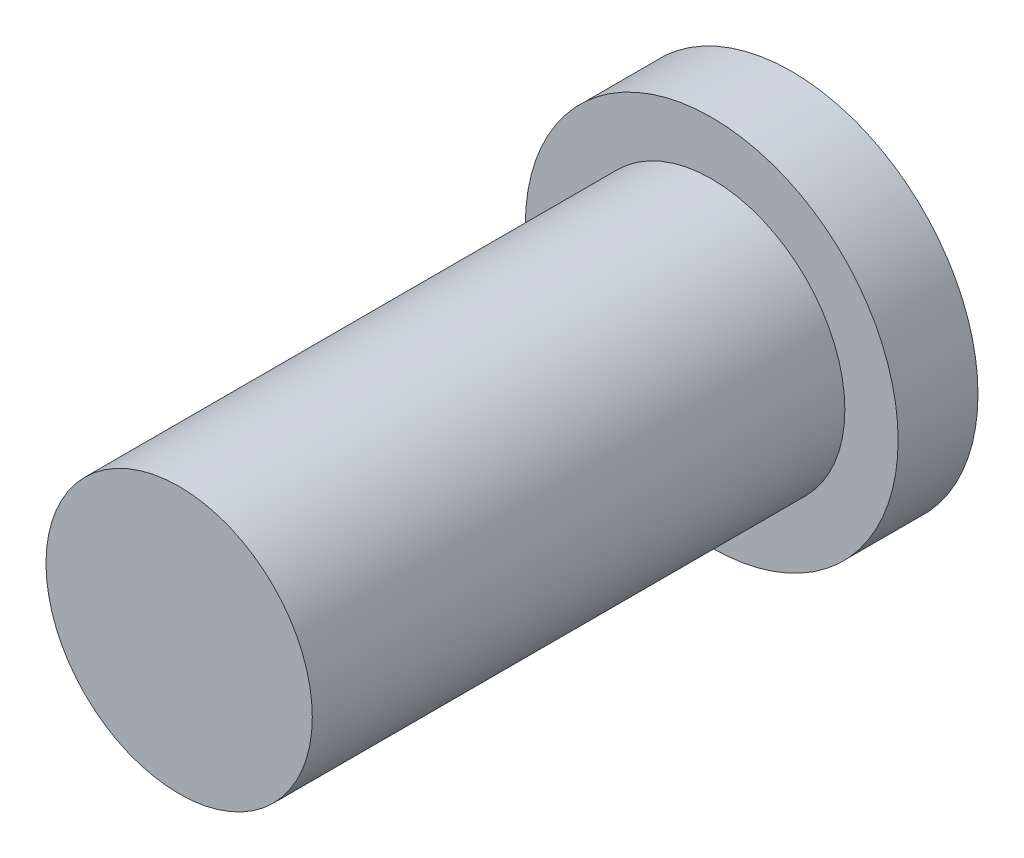
ISO-10303-21;
HEADER;
FILE_DESCRIPTION(('STEP AP214'),'2;1');
FILE_NAME('part.step','',(''),(''),'','','');
FILE_SCHEMA(('AUTOMOTIVE_DESIGN { 1 0 10303 214 1 1 1 1 }'));
ENDSEC;
DATA;
#1=APPLICATION_CONTEXT('core data for automotive mechanical design processes');
#2=APPLICATION_PROTOCOL_DEFINITION('international standard','automotive_design',2000,#1);
#3=PRODUCT_CONTEXT('',#1,'mechanical');
#4=PRODUCT('Part','Part','',(#3));
#5=PRODUCT_RELATED_PRODUCT_CATEGORY('part','',(#4));
#6=PRODUCT_DEFINITION_FORMATION('','',#4);
#7=PRODUCT_DEFINITION_CONTEXT('part definition',#1,'design');
#8=PRODUCT_DEFINITION('design','',#6,#7);
#9=PRODUCT_DEFINITION_SHAPE('','',#8);
#10=(LENGTH_UNIT() NAMED_UNIT(*) SI_UNIT(.MILLI.,.METRE.));
#11=(NAMED_UNIT(*) PLANE_ANGLE_UNIT() SI_UNIT($,.RADIAN.));
#12=(NAMED_UNIT(*) SI_UNIT($,.STERADIAN.) SOLID_ANGLE_UNIT());
#13=UNCERTAINTY_MEASURE_WITH_UNIT(LENGTH_MEASURE(1.E-05),#10,'distance_accuracy_value','');
#14=(GEOMETRIC_REPRESENTATION_CONTEXT(3) GLOBAL_UNCERTAINTY_ASSIGNED_CONTEXT((#13)) GLOBAL_UNIT_ASSIGNED_CONTEXT((#10,
#11,#12)) REPRESENTATION_CONTEXT('',''));
#15=CARTESIAN_POINT('',(0.,0.,0.));
#16=DIRECTION('',(0.,0.,1.));
#17=DIRECTION('',(1.,0.,0.));
#18=AXIS2_PLACEMENT_3D('',#15,#16,#17);
#19=CARTESIAN_POINT('',(0.,0.,10.));
#20=DIRECTION('',(0.,0.,-1.));
#21=DIRECTION('',(-1.,0.,0.));
#22=AXIS2_PLACEMENT_3D('',#19,#20,#21);
#23=CYLINDRICAL_SURFACE('',#22,2.5);
#24=CARTESIAN_POINT('',(0.,0.,10.));
#25=DIRECTION('',(0.,0.,1.));
#26=DIRECTION('',(1.,0.,0.));
#27=AXIS2_PLACEMENT_3D('',#24,#25,#26);
#28=CIRCLE('',#27,2.5);
#29=CARTESIAN_POINT('',(2.5,0.,10.));
#30=VERTEX_POINT('',#29);
#31=EDGE_CURVE('E10',#30,#30,#28,.T.);
#32=ORIENTED_EDGE('',*,*,#31,.F.);
#33=EDGE_LOOP('',(#32));
#34=FACE_BOUND('',#33,.T.);
#35=CARTESIAN_POINT('',(0.,0.,0.));
#36=DIRECTION('',(0.,0.,1.));
#37=DIRECTION('',(1.,0.,0.));
#38=AXIS2_PLACEMENT_3D('',#35,#36,#37);
#39=CIRCLE('',#38,2.5);
#40=CARTESIAN_POINT('',(2.5,0.,0.));
#41=VERTEX_POINT('',#40);
#42=EDGE_CURVE('E40',#41,#41,#39,.T.);
#43=ORIENTED_EDGE('',*,*,#42,.T.);
#44=EDGE_LOOP('',(#43));
#45=FACE_BOUND('',#44,.T.);
#46=ADVANCED_FACE('F37',(#34,#45),#23,.T.);
#47=CARTESIAN_POINT('',(0.,0.,10.));
#48=DIRECTION('',(0.,0.,1.));
#49=DIRECTION('',(1.,0.,0.));
#50=AXIS2_PLACEMENT_3D('',#47,#48,#49);
#51=PLANE('',#50);
#52=ORIENTED_EDGE('',*,*,#31,.T.);
#53=EDGE_LOOP('',(#52));
#54=FACE_BOUND('',#53,.T.);
#55=ADVANCED_FACE('F64',(#54),#51,.T.);
#56=CARTESIAN_POINT('',(0.,0.,-1.5));
#57=DIRECTION('',(0.,0.,1.));
#58=DIRECTION('',(1.,0.,0.));
#59=AXIS2_PLACEMENT_3D('',#56,#57,#58);
#60=CYLINDRICAL_SURFACE('',#59,3.5);
#61=CARTESIAN_POINT('',(0.,0.,-1.5));
#62=DIRECTION('',(0.,0.,-1.));
#63=DIRECTION('',(-1.,0.,0.));
#64=AXIS2_PLACEMENT_3D('',#61,#62,#63);
#65=CIRCLE('',#64,3.5);
#66=CARTESIAN_POINT('',(-3.5,0.,-1.5));
#67=VERTEX_POINT('',#66);
#68=EDGE_CURVE('E49',#67,#67,#65,.T.);
#69=ORIENTED_EDGE('',*,*,#68,.F.);
#70=EDGE_LOOP('',(#69));
#71=FACE_BOUND('',#70,.T.);
#72=CARTESIAN_POINT('',(0.,0.,0.));
#73=DIRECTION('',(0.,0.,-1.));
#74=DIRECTION('',(-1.,0.,0.));
#75=AXIS2_PLACEMENT_3D('',#72,#73,#74);
#76=CIRCLE('',#75,3.5);
#77=CARTESIAN_POINT('',(-3.5,0.,0.));
#78=VERTEX_POINT('',#77);
#79=EDGE_CURVE('E51',#78,#78,#76,.T.);
#80=ORIENTED_EDGE('',*,*,#79,.T.);
#81=EDGE_LOOP('',(#80));
#82=FACE_BOUND('',#81,.T.);
#83=ADVANCED_FACE('F61',(#71,#82),#60,.T.);
#84=CARTESIAN_POINT('',(0.,0.,-1.5));
#85=DIRECTION('',(0.,0.,-1.));
#86=DIRECTION('',(-1.,0.,0.));
#87=AXIS2_PLACEMENT_3D('',#84,#85,#86);
#88=PLANE('',#87);
#89=ORIENTED_EDGE('',*,*,#68,.T.);
#90=EDGE_LOOP('',(#89));
#91=FACE_BOUND('',#90,.T.);
#92=ADVANCED_FACE('F59',(#91),#88,.T.);
#93=CARTESIAN_POINT('',(0.,0.,0.));
#94=DIRECTION('',(0.,0.,-1.));
#95=DIRECTION('',(-1.,0.,0.));
#96=AXIS2_PLACEMENT_3D('',#93,#94,#95);
#97=PLANE('',#96);
#98=ORIENTED_EDGE('',*,*,#42,.F.);
#99=EDGE_LOOP('',(#98));
#100=FACE_BOUND('',#99,.T.);
#101=ORIENTED_EDGE('',*,*,#79,.F.);
#102=EDGE_LOOP('',(#101));
#103=FACE_BOUND('',#102,.T.);
#104=ADVANCED_FACE('F68',(#100,#103),#97,.F.);
#105=CLOSED_SHELL('',(#46,#55,#83,#92,#104));
#106=MANIFOLD_SOLID_BREP('B2',#105);
#107=ADVANCED_BREP_SHAPE_REPRESENTATION('',(#18,#106),#14);
#108=SHAPE_DEFINITION_REPRESENTATION(#9,#107);
ENDSEC;
END-ISO-10303-21;
